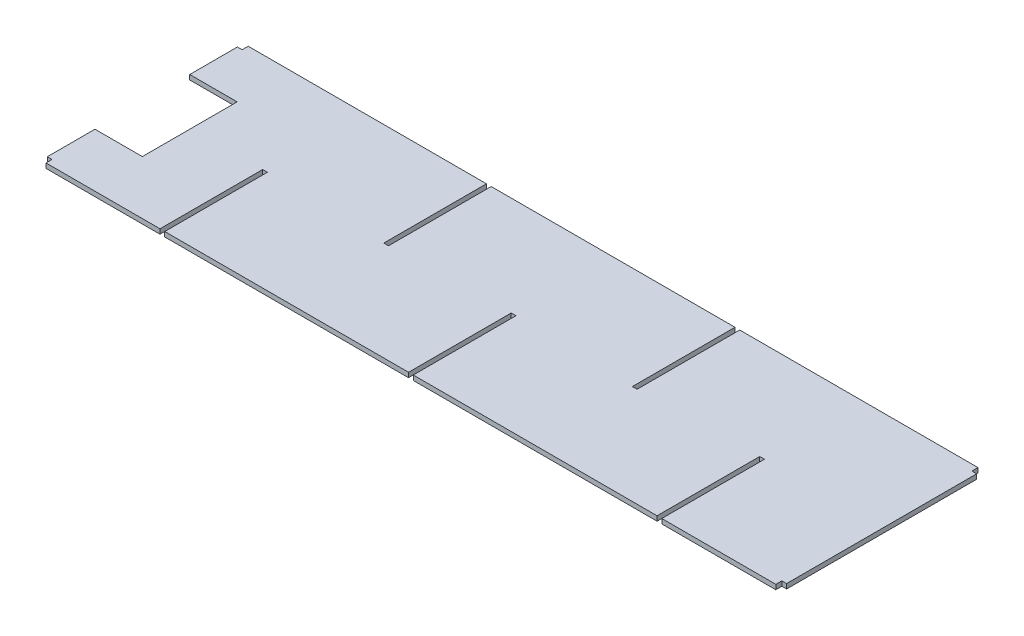
ISO-10303-21;
HEADER;
FILE_DESCRIPTION(('STEP AP214'),'2;1');
FILE_NAME('part.step','',(''),(''),'','','');
FILE_SCHEMA(('AUTOMOTIVE_DESIGN { 1 0 10303 214 1 1 1 1 }'));
ENDSEC;
DATA;
#1=APPLICATION_CONTEXT('core data for automotive mechanical design processes');
#2=APPLICATION_PROTOCOL_DEFINITION('international standard','automotive_design',2000,#1);
#3=PRODUCT_CONTEXT('',#1,'mechanical');
#4=PRODUCT('Part','Part','',(#3));
#5=PRODUCT_RELATED_PRODUCT_CATEGORY('part','',(#4));
#6=PRODUCT_DEFINITION_FORMATION('','',#4);
#7=PRODUCT_DEFINITION_CONTEXT('part definition',#1,'design');
#8=PRODUCT_DEFINITION('design','',#6,#7);
#9=PRODUCT_DEFINITION_SHAPE('','',#8);
#10=(LENGTH_UNIT() NAMED_UNIT(*) SI_UNIT(.MILLI.,.METRE.));
#11=(NAMED_UNIT(*) PLANE_ANGLE_UNIT() SI_UNIT($,.RADIAN.));
#12=(NAMED_UNIT(*) SI_UNIT($,.STERADIAN.) SOLID_ANGLE_UNIT());
#13=UNCERTAINTY_MEASURE_WITH_UNIT(LENGTH_MEASURE(1.E-05),#10,'distance_accuracy_value','');
#14=(GEOMETRIC_REPRESENTATION_CONTEXT(3) GLOBAL_UNCERTAINTY_ASSIGNED_CONTEXT((#13)) GLOBAL_UNIT_ASSIGNED_CONTEXT((#10,
#11,#12)) REPRESENTATION_CONTEXT('',''));
#15=CARTESIAN_POINT('',(0.,0.,0.));
#16=DIRECTION('',(0.,0.,1.));
#17=DIRECTION('',(1.,0.,0.));
#18=AXIS2_PLACEMENT_3D('',#15,#16,#17);
#19=CARTESIAN_POINT('',(0.,1.5,0.));
#20=DIRECTION('',(1.,0.,0.));
#21=DIRECTION('',(0.,0.,-1.));
#22=AXIS2_PLACEMENT_3D('',#19,#20,#21);
#23=PLANE('',#22);
#24=DIRECTION('',(0.,0.,1.));
#25=VECTOR('',#24,1.);
#26=CARTESIAN_POINT('',(0.,1.5,0.));
#27=LINE('',#26,#25);
#28=CARTESIAN_POINT('',(0.,1.5,-62.085));
#29=VERTEX_POINT('',#28);
#30=CARTESIAN_POINT('',(0.,1.5,-47.));
#31=VERTEX_POINT('',#30);
#32=EDGE_CURVE('E545',#29,#31,#27,.T.);
#33=ORIENTED_EDGE('',*,*,#32,.F.);
#34=DIRECTION('',(0.,1.,0.));
#35=VECTOR('',#34,1.);
#36=CARTESIAN_POINT('',(0.,0.,-62.085));
#37=LINE('',#36,#35);
#38=CARTESIAN_POINT('',(0.,0.,-62.085));
#39=VERTEX_POINT('',#38);
#40=EDGE_CURVE('E310',#39,#29,#37,.T.);
#41=ORIENTED_EDGE('',*,*,#40,.F.);
#42=DIRECTION('',(0.,0.,1.));
#43=VECTOR('',#42,1.);
#44=CARTESIAN_POINT('',(0.,0.,0.));
#45=LINE('',#44,#43);
#46=CARTESIAN_POINT('',(0.,0.,-47.));
#47=VERTEX_POINT('',#46);
#48=EDGE_CURVE('E303',#39,#47,#45,.T.);
#49=ORIENTED_EDGE('',*,*,#48,.T.);
#50=DIRECTION('',(0.,1.,0.));
#51=VECTOR('',#50,1.);
#52=CARTESIAN_POINT('',(0.,0.,-47.));
#53=LINE('',#52,#51);
#54=EDGE_CURVE('E284',#47,#31,#53,.T.);
#55=ORIENTED_EDGE('',*,*,#54,.T.);
#56=EDGE_LOOP('',(#33,#41,#49,#55));
#57=FACE_BOUND('',#56,.T.);
#58=ADVANCED_FACE('F45',(#57),#23,.F.);
#59=CARTESIAN_POINT('',(0.,1.5,0.));
#60=DIRECTION('',(0.,0.,-1.));
#61=DIRECTION('',(-1.,0.,0.));
#62=AXIS2_PLACEMENT_3D('',#59,#60,#61);
#63=PLANE('',#62);
#64=DIRECTION('',(1.,0.,0.));
#65=VECTOR('',#64,1.);
#66=CARTESIAN_POINT('',(0.,0.,0.));
#67=LINE('',#66,#65);
#68=CARTESIAN_POINT('',(117.75,0.,0.));
#69=VERTEX_POINT('',#68);
#70=CARTESIAN_POINT('',(194.916666666667,0.,0.));
#71=VERTEX_POINT('',#70);
#72=EDGE_CURVE('E318',#69,#71,#67,.T.);
#73=ORIENTED_EDGE('',*,*,#72,.T.);
#74=DIRECTION('',(0.,1.,0.));
#75=VECTOR('',#74,1.);
#76=CARTESIAN_POINT('',(194.916666666667,0.,0.));
#77=LINE('',#76,#75);
#78=CARTESIAN_POINT('',(194.916666666667,1.5,0.));
#79=VERTEX_POINT('',#78);
#80=EDGE_CURVE('E356',#71,#79,#77,.T.);
#81=ORIENTED_EDGE('',*,*,#80,.T.);
#82=DIRECTION('',(1.,0.,0.));
#83=VECTOR('',#82,1.);
#84=CARTESIAN_POINT('',(0.,1.5,0.));
#85=LINE('',#84,#83);
#86=CARTESIAN_POINT('',(117.75,1.5,0.));
#87=VERTEX_POINT('',#86);
#88=EDGE_CURVE('E549',#87,#79,#85,.T.);
#89=ORIENTED_EDGE('',*,*,#88,.F.);
#90=DIRECTION('',(0.,1.,0.));
#91=VECTOR('',#90,1.);
#92=CARTESIAN_POINT('',(117.75,0.,0.));
#93=LINE('',#92,#91);
#94=EDGE_CURVE('E358',#69,#87,#93,.T.);
#95=ORIENTED_EDGE('',*,*,#94,.F.);
#96=EDGE_LOOP('',(#73,#81,#89,#95));
#97=FACE_BOUND('',#96,.T.);
#98=ADVANCED_FACE('F354',(#97),#63,.F.);
#99=CARTESIAN_POINT('',(39.0833333333333,0.,0.));
#100=VERTEX_POINT('',#99);
#101=CARTESIAN_POINT('',(116.25,0.,0.));
#102=VERTEX_POINT('',#101);
#103=EDGE_CURVE('E337',#100,#102,#67,.T.);
#104=ORIENTED_EDGE('',*,*,#103,.T.);
#105=DIRECTION('',(0.,1.,0.));
#106=VECTOR('',#105,1.);
#107=CARTESIAN_POINT('',(116.25,0.,0.));
#108=LINE('',#107,#106);
#109=CARTESIAN_POINT('',(116.25,1.5,0.));
#110=VERTEX_POINT('',#109);
#111=EDGE_CURVE('E384',#102,#110,#108,.T.);
#112=ORIENTED_EDGE('',*,*,#111,.T.);
#113=CARTESIAN_POINT('',(39.0833333333333,1.5,0.));
#114=VERTEX_POINT('',#113);
#115=EDGE_CURVE('E560',#114,#110,#85,.T.);
#116=ORIENTED_EDGE('',*,*,#115,.F.);
#117=DIRECTION('',(0.,1.,0.));
#118=VECTOR('',#117,1.);
#119=CARTESIAN_POINT('',(39.0833333333333,0.,0.));
#120=LINE('',#119,#118);
#121=EDGE_CURVE('E436',#100,#114,#120,.T.);
#122=ORIENTED_EDGE('',*,*,#121,.F.);
#123=EDGE_LOOP('',(#104,#112,#116,#122));
#124=FACE_BOUND('',#123,.T.);
#125=ADVANCED_FACE('F766',(#124),#63,.F.);
#126=CARTESIAN_POINT('',(1.50000000000001,1.5,0.));
#127=VERTEX_POINT('',#126);
#128=CARTESIAN_POINT('',(37.5833333333333,1.5,0.));
#129=VERTEX_POINT('',#128);
#130=EDGE_CURVE('E550',#127,#129,#85,.T.);
#131=ORIENTED_EDGE('',*,*,#130,.F.);
#132=DIRECTION('',(0.,1.,0.));
#133=VECTOR('',#132,1.);
#134=CARTESIAN_POINT('',(1.50000000000001,0.,0.));
#135=LINE('',#134,#133);
#136=CARTESIAN_POINT('',(1.50000000000001,0.,0.));
#137=VERTEX_POINT('',#136);
#138=EDGE_CURVE('E608',#137,#127,#135,.T.);
#139=ORIENTED_EDGE('',*,*,#138,.F.);
#140=CARTESIAN_POINT('',(37.5833333333333,0.,0.));
#141=VERTEX_POINT('',#140);
#142=EDGE_CURVE('E320',#137,#141,#67,.T.);
#143=ORIENTED_EDGE('',*,*,#142,.T.);
#144=DIRECTION('',(0.,1.,0.));
#145=VECTOR('',#144,1.);
#146=CARTESIAN_POINT('',(37.5833333333333,0.,0.));
#147=LINE('',#146,#145);
#148=EDGE_CURVE('E426',#141,#129,#147,.T.);
#149=ORIENTED_EDGE('',*,*,#148,.T.);
#150=EDGE_LOOP('',(#131,#139,#143,#149));
#151=FACE_BOUND('',#150,.T.);
#152=ADVANCED_FACE('F773',(#151),#63,.F.);
#153=CARTESIAN_POINT('',(0.,1.5,-64.));
#154=DIRECTION('',(0.,0.,1.));
#155=DIRECTION('',(1.,0.,0.));
#156=AXIS2_PLACEMENT_3D('',#153,#154,#155);
#157=PLANE('',#156);
#158=DIRECTION('',(-1.,0.,0.));
#159=VECTOR('',#158,1.);
#160=CARTESIAN_POINT('',(0.,1.5,-64.));
#161=LINE('',#160,#159);
#162=CARTESIAN_POINT('',(232.5,1.5,-64.));
#163=VERTEX_POINT('',#162);
#164=CARTESIAN_POINT('',(157.083333333333,1.5,-64.));
#165=VERTEX_POINT('',#164);
#166=EDGE_CURVE('E11',#163,#165,#161,.T.);
#167=ORIENTED_EDGE('',*,*,#166,.F.);
#168=DIRECTION('',(0.,1.,0.));
#169=VECTOR('',#168,1.);
#170=CARTESIAN_POINT('',(232.5,0.,-64.));
#171=LINE('',#170,#169);
#172=CARTESIAN_POINT('',(232.5,0.,-64.));
#173=VERTEX_POINT('',#172);
#174=EDGE_CURVE('E642',#173,#163,#171,.T.);
#175=ORIENTED_EDGE('',*,*,#174,.F.);
#176=DIRECTION('',(-1.,0.,0.));
#177=VECTOR('',#176,1.);
#178=CARTESIAN_POINT('',(0.,0.,-64.));
#179=LINE('',#178,#177);
#180=CARTESIAN_POINT('',(157.083333333333,0.,-64.));
#181=VERTEX_POINT('',#180);
#182=EDGE_CURVE('E335',#173,#181,#179,.T.);
#183=ORIENTED_EDGE('',*,*,#182,.T.);
#184=DIRECTION('',(0.,1.,0.));
#185=VECTOR('',#184,1.);
#186=CARTESIAN_POINT('',(157.083333333333,0.,-64.));
#187=LINE('',#186,#185);
#188=EDGE_CURVE('E397',#181,#165,#187,.T.);
#189=ORIENTED_EDGE('',*,*,#188,.T.);
#190=EDGE_LOOP('',(#167,#175,#183,#189));
#191=FACE_BOUND('',#190,.T.);
#192=ADVANCED_FACE('F732',(#191),#157,.F.);
#193=CARTESIAN_POINT('',(76.9166666666666,0.,-64.));
#194=VERTEX_POINT('',#193);
#195=CARTESIAN_POINT('',(1.5,0.,-64.));
#196=VERTEX_POINT('',#195);
#197=EDGE_CURVE('E49',#194,#196,#179,.T.);
#198=ORIENTED_EDGE('',*,*,#197,.T.);
#199=DIRECTION('',(0.,1.,0.));
#200=VECTOR('',#199,1.);
#201=CARTESIAN_POINT('',(1.5,0.,-64.));
#202=LINE('',#201,#200);
#203=CARTESIAN_POINT('',(1.5,1.5,-64.));
#204=VERTEX_POINT('',#203);
#205=EDGE_CURVE('E632',#196,#204,#202,.T.);
#206=ORIENTED_EDGE('',*,*,#205,.T.);
#207=CARTESIAN_POINT('',(76.9166666666666,1.5,-64.));
#208=VERTEX_POINT('',#207);
#209=EDGE_CURVE('E57',#208,#204,#161,.T.);
#210=ORIENTED_EDGE('',*,*,#209,.F.);
#211=DIRECTION('',(0.,1.,0.));
#212=VECTOR('',#211,1.);
#213=CARTESIAN_POINT('',(76.9166666666666,0.,-64.));
#214=LINE('',#213,#212);
#215=EDGE_CURVE('E594',#194,#208,#214,.T.);
#216=ORIENTED_EDGE('',*,*,#215,.F.);
#217=EDGE_LOOP('',(#198,#206,#210,#216));
#218=FACE_BOUND('',#217,.T.);
#219=ADVANCED_FACE('F711',(#218),#157,.F.);
#220=CARTESIAN_POINT('',(0.,0.,-17.));
#221=VERTEX_POINT('',#220);
#222=CARTESIAN_POINT('',(0.,0.,-1.915));
#223=VERTEX_POINT('',#222);
#224=EDGE_CURVE('E313',#221,#223,#45,.T.);
#225=ORIENTED_EDGE('',*,*,#224,.T.);
#226=DIRECTION('',(0.,1.,0.));
#227=VECTOR('',#226,1.);
#228=CARTESIAN_POINT('',(0.,0.,-1.915));
#229=LINE('',#228,#227);
#230=CARTESIAN_POINT('',(0.,1.5,-1.915));
#231=VERTEX_POINT('',#230);
#232=EDGE_CURVE('E615',#223,#231,#229,.T.);
#233=ORIENTED_EDGE('',*,*,#232,.T.);
#234=CARTESIAN_POINT('',(0.,1.5,-17.));
#235=VERTEX_POINT('',#234);
#236=EDGE_CURVE('E541',#235,#231,#27,.T.);
#237=ORIENTED_EDGE('',*,*,#236,.F.);
#238=DIRECTION('',(0.,1.,0.));
#239=VECTOR('',#238,1.);
#240=CARTESIAN_POINT('',(0.,0.,-17.));
#241=LINE('',#240,#239);
#242=EDGE_CURVE('E307',#221,#235,#241,.T.);
#243=ORIENTED_EDGE('',*,*,#242,.F.);
#244=EDGE_LOOP('',(#225,#233,#237,#243));
#245=FACE_BOUND('',#244,.T.);
#246=ADVANCED_FACE('F47',(#245),#23,.F.);
#247=CARTESIAN_POINT('',(196.416666666667,0.,0.));
#248=VERTEX_POINT('',#247);
#249=CARTESIAN_POINT('',(232.5,0.,0.));
#250=VERTEX_POINT('',#249);
#251=EDGE_CURVE('E312',#248,#250,#67,.T.);
#252=ORIENTED_EDGE('',*,*,#251,.T.);
#253=DIRECTION('',(0.,1.,0.));
#254=VECTOR('',#253,1.);
#255=CARTESIAN_POINT('',(232.5,0.,0.));
#256=LINE('',#255,#254);
#257=CARTESIAN_POINT('',(232.5,1.5,0.));
#258=VERTEX_POINT('',#257);
#259=EDGE_CURVE('E663',#250,#258,#256,.T.);
#260=ORIENTED_EDGE('',*,*,#259,.T.);
#261=CARTESIAN_POINT('',(196.416666666667,1.5,0.));
#262=VERTEX_POINT('',#261);
#263=EDGE_CURVE('E546',#262,#258,#85,.T.);
#264=ORIENTED_EDGE('',*,*,#263,.F.);
#265=DIRECTION('',(0.,1.,0.));
#266=VECTOR('',#265,1.);
#267=CARTESIAN_POINT('',(196.416666666667,0.,0.));
#268=LINE('',#267,#266);
#269=EDGE_CURVE('E371',#248,#262,#268,.T.);
#270=ORIENTED_EDGE('',*,*,#269,.F.);
#271=EDGE_LOOP('',(#252,#260,#264,#270));
#272=FACE_BOUND('',#271,.T.);
#273=ADVANCED_FACE('F747',(#272),#63,.F.);
#274=CARTESIAN_POINT('',(234.,1.5,0.));
#275=DIRECTION('',(-1.,0.,0.));
#276=DIRECTION('',(0.,0.,1.));
#277=AXIS2_PLACEMENT_3D('',#274,#275,#276);
#278=PLANE('',#277);
#279=DIRECTION('',(0.,0.,-1.));
#280=VECTOR('',#279,1.);
#281=CARTESIAN_POINT('',(234.,1.5,0.));
#282=LINE('',#281,#280);
#283=CARTESIAN_POINT('',(234.,1.5,-1.915));
#284=VERTEX_POINT('',#283);
#285=CARTESIAN_POINT('',(234.,1.5,-62.085));
#286=VERTEX_POINT('',#285);
#287=EDGE_CURVE('E551',#284,#286,#282,.T.);
#288=ORIENTED_EDGE('',*,*,#287,.F.);
#289=DIRECTION('',(0.,1.,0.));
#290=VECTOR('',#289,1.);
#291=CARTESIAN_POINT('',(234.,0.,-1.915));
#292=LINE('',#291,#290);
#293=CARTESIAN_POINT('',(234.,0.,-1.915));
#294=VERTEX_POINT('',#293);
#295=EDGE_CURVE('E657',#294,#284,#292,.T.);
#296=ORIENTED_EDGE('',*,*,#295,.F.);
#297=DIRECTION('',(0.,0.,-1.));
#298=VECTOR('',#297,1.);
#299=CARTESIAN_POINT('',(234.,0.,0.));
#300=LINE('',#299,#298);
#301=CARTESIAN_POINT('',(234.,0.,-62.085));
#302=VERTEX_POINT('',#301);
#303=EDGE_CURVE('E324',#294,#302,#300,.T.);
#304=ORIENTED_EDGE('',*,*,#303,.T.);
#305=DIRECTION('',(0.,1.,0.));
#306=VECTOR('',#305,1.);
#307=CARTESIAN_POINT('',(234.,0.,-62.085));
#308=LINE('',#307,#306);
#309=EDGE_CURVE('E648',#302,#286,#308,.T.);
#310=ORIENTED_EDGE('',*,*,#309,.T.);
#311=EDGE_LOOP('',(#288,#296,#304,#310));
#312=FACE_BOUND('',#311,.T.);
#313=ADVANCED_FACE('F739',(#312),#278,.F.);
#314=CARTESIAN_POINT('',(155.583333333333,1.5,-64.));
#315=VERTEX_POINT('',#314);
#316=CARTESIAN_POINT('',(78.4166666666667,1.5,-64.));
#317=VERTEX_POINT('',#316);
#318=EDGE_CURVE('E55',#315,#317,#161,.T.);
#319=ORIENTED_EDGE('',*,*,#318,.F.);
#320=DIRECTION('',(0.,1.,0.));
#321=VECTOR('',#320,1.);
#322=CARTESIAN_POINT('',(155.583333333333,0.,-64.));
#323=LINE('',#322,#321);
#324=CARTESIAN_POINT('',(155.583333333333,0.,-64.));
#325=VERTEX_POINT('',#324);
#326=EDGE_CURVE('E385',#325,#315,#323,.T.);
#327=ORIENTED_EDGE('',*,*,#326,.F.);
#328=CARTESIAN_POINT('',(78.4166666666667,0.,-64.));
#329=VERTEX_POINT('',#328);
#330=EDGE_CURVE('E334',#325,#329,#179,.T.);
#331=ORIENTED_EDGE('',*,*,#330,.T.);
#332=DIRECTION('',(0.,1.,0.));
#333=VECTOR('',#332,1.);
#334=CARTESIAN_POINT('',(78.4166666666667,0.,-64.));
#335=LINE('',#334,#333);
#336=EDGE_CURVE('E690',#329,#317,#335,.T.);
#337=ORIENTED_EDGE('',*,*,#336,.T.);
#338=EDGE_LOOP('',(#319,#327,#331,#337));
#339=FACE_BOUND('',#338,.T.);
#340=ADVANCED_FACE('F722',(#339),#157,.F.);
#341=CARTESIAN_POINT('',(0.,1.5,0.));
#342=DIRECTION('',(0.,-1.,0.));
#343=DIRECTION('',(0.,0.,-1.));
#344=AXIS2_PLACEMENT_3D('',#341,#342,#343);
#345=PLANE('',#344);
#346=ORIENTED_EDGE('',*,*,#263,.T.);
#347=DIRECTION('',(0.,0.,-1.));
#348=VECTOR('',#347,1.);
#349=CARTESIAN_POINT('',(232.5,1.5,-3.36980226142753E-12));
#350=LINE('',#349,#348);
#351=CARTESIAN_POINT('',(232.5,1.5,-1.915));
#352=VERTEX_POINT('',#351);
#353=EDGE_CURVE('E322',#258,#352,#350,.T.);
#354=ORIENTED_EDGE('',*,*,#353,.T.);
#355=DIRECTION('',(1.,0.,0.));
#356=VECTOR('',#355,1.);
#357=CARTESIAN_POINT('',(0.,1.5,-1.915));
#358=LINE('',#357,#356);
#359=EDGE_CURVE('E534',#352,#284,#358,.T.);
#360=ORIENTED_EDGE('',*,*,#359,.T.);
#361=ORIENTED_EDGE('',*,*,#287,.T.);
#362=DIRECTION('',(-1.,0.,0.));
#363=VECTOR('',#362,1.);
#364=CARTESIAN_POINT('',(0.,1.5,-62.085));
#365=LINE('',#364,#363);
#366=CARTESIAN_POINT('',(232.5,1.5,-62.085));
#367=VERTEX_POINT('',#366);
#368=EDGE_CURVE('E530',#286,#367,#365,.T.);
#369=ORIENTED_EDGE('',*,*,#368,.T.);
#370=DIRECTION('',(0.,0.,-1.));
#371=VECTOR('',#370,1.);
#372=CARTESIAN_POINT('',(232.499999999999,1.5,3.36980226142752E-12));
#373=LINE('',#372,#371);
#374=EDGE_CURVE('E526',#367,#163,#373,.T.);
#375=ORIENTED_EDGE('',*,*,#374,.T.);
#376=ORIENTED_EDGE('',*,*,#166,.T.);
#377=DIRECTION('',(0.,0.,1.));
#378=VECTOR('',#377,1.);
#379=CARTESIAN_POINT('',(157.083333333333,1.5,0.));
#380=LINE('',#379,#378);
#381=CARTESIAN_POINT('',(157.083333333333,1.5,-31.5));
#382=VERTEX_POINT('',#381);
#383=EDGE_CURVE('E506',#165,#382,#380,.T.);
#384=ORIENTED_EDGE('',*,*,#383,.T.);
#385=DIRECTION('',(-1.,0.,0.));
#386=VECTOR('',#385,1.);
#387=CARTESIAN_POINT('',(0.,1.5,-31.5));
#388=LINE('',#387,#386);
#389=CARTESIAN_POINT('',(155.583333333333,1.5,-31.5));
#390=VERTEX_POINT('',#389);
#391=EDGE_CURVE('E502',#382,#390,#388,.T.);
#392=ORIENTED_EDGE('',*,*,#391,.T.);
#393=DIRECTION('',(0.,0.,-1.));
#394=VECTOR('',#393,1.);
#395=CARTESIAN_POINT('',(155.583333333333,1.5,0.));
#396=LINE('',#395,#394);
#397=EDGE_CURVE('E498',#390,#315,#396,.T.);
#398=ORIENTED_EDGE('',*,*,#397,.T.);
#399=ORIENTED_EDGE('',*,*,#318,.T.);
#400=DIRECTION('',(0.,0.,1.));
#401=VECTOR('',#400,1.);
#402=CARTESIAN_POINT('',(78.4166666666667,1.5,0.));
#403=LINE('',#402,#401);
#404=CARTESIAN_POINT('',(78.4166666666667,1.5,-31.5));
#405=VERTEX_POINT('',#404);
#406=EDGE_CURVE('E466',#317,#405,#403,.T.);
#407=ORIENTED_EDGE('',*,*,#406,.T.);
#408=DIRECTION('',(-1.,0.,0.));
#409=VECTOR('',#408,1.);
#410=CARTESIAN_POINT('',(0.,1.5,-31.5));
#411=LINE('',#410,#409);
#412=CARTESIAN_POINT('',(76.9166666666667,1.5,-31.5));
#413=VERTEX_POINT('',#412);
#414=EDGE_CURVE('E462',#405,#413,#411,.T.);
#415=ORIENTED_EDGE('',*,*,#414,.T.);
#416=DIRECTION('',(0.,0.,-1.));
#417=VECTOR('',#416,1.);
#418=CARTESIAN_POINT('',(76.9166666666667,1.5,0.));
#419=LINE('',#418,#417);
#420=EDGE_CURVE('E470',#413,#208,#419,.T.);
#421=ORIENTED_EDGE('',*,*,#420,.T.);
#422=ORIENTED_EDGE('',*,*,#209,.T.);
#423=DIRECTION('',(0.,0.,1.));
#424=VECTOR('',#423,1.);
#425=CARTESIAN_POINT('',(1.5,1.5,0.));
#426=LINE('',#425,#424);
#427=CARTESIAN_POINT('',(1.5,1.5,-62.085));
#428=VERTEX_POINT('',#427);
#429=EDGE_CURVE('E522',#204,#428,#426,.T.);
#430=ORIENTED_EDGE('',*,*,#429,.T.);
#431=DIRECTION('',(-1.,0.,0.));
#432=VECTOR('',#431,1.);
#433=CARTESIAN_POINT('',(0.,1.5,-62.085));
#434=LINE('',#433,#432);
#435=EDGE_CURVE('E518',#428,#29,#434,.T.);
#436=ORIENTED_EDGE('',*,*,#435,.T.);
#437=ORIENTED_EDGE('',*,*,#32,.T.);
#438=DIRECTION('',(1.,0.,0.));
#439=VECTOR('',#438,1.);
#440=CARTESIAN_POINT('',(0.,1.5,-47.));
#441=LINE('',#440,#439);
#442=CARTESIAN_POINT('',(15.,1.5,-47.));
#443=VERTEX_POINT('',#442);
#444=EDGE_CURVE('E291',#31,#443,#441,.T.);
#445=ORIENTED_EDGE('',*,*,#444,.T.);
#446=DIRECTION('',(0.,0.,1.));
#447=VECTOR('',#446,1.);
#448=CARTESIAN_POINT('',(15.,1.5,0.));
#449=LINE('',#448,#447);
#450=CARTESIAN_POINT('',(15.,1.5,-17.));
#451=VERTEX_POINT('',#450);
#452=EDGE_CURVE('E456',#443,#451,#449,.T.);
#453=ORIENTED_EDGE('',*,*,#452,.T.);
#454=DIRECTION('',(-1.,0.,0.));
#455=VECTOR('',#454,1.);
#456=CARTESIAN_POINT('',(0.,1.5,-17.));
#457=LINE('',#456,#455);
#458=EDGE_CURVE('E452',#451,#235,#457,.T.);
#459=ORIENTED_EDGE('',*,*,#458,.T.);
#460=ORIENTED_EDGE('',*,*,#236,.T.);
#461=DIRECTION('',(1.,0.,0.));
#462=VECTOR('',#461,1.);
#463=CARTESIAN_POINT('',(0.,1.5,-1.915));
#464=LINE('',#463,#462);
#465=CARTESIAN_POINT('',(1.50000000000001,1.5,-1.915));
#466=VERTEX_POINT('',#465);
#467=EDGE_CURVE('E514',#231,#466,#464,.T.);
#468=ORIENTED_EDGE('',*,*,#467,.T.);
#469=DIRECTION('',(0.,0.,1.));
#470=VECTOR('',#469,1.);
#471=CARTESIAN_POINT('',(1.50000000000001,1.5,0.));
#472=LINE('',#471,#470);
#473=EDGE_CURVE('E510',#466,#127,#472,.T.);
#474=ORIENTED_EDGE('',*,*,#473,.T.);
#475=ORIENTED_EDGE('',*,*,#130,.T.);
#476=DIRECTION('',(0.,0.,-1.));
#477=VECTOR('',#476,1.);
#478=CARTESIAN_POINT('',(37.5833333333333,1.5,0.));
#479=LINE('',#478,#477);
#480=CARTESIAN_POINT('',(37.5833333333333,1.5,-32.5));
#481=VERTEX_POINT('',#480);
#482=EDGE_CURVE('E448',#129,#481,#479,.T.);
#483=ORIENTED_EDGE('',*,*,#482,.T.);
#484=DIRECTION('',(1.,0.,0.));
#485=VECTOR('',#484,1.);
#486=CARTESIAN_POINT('',(0.,1.5,-32.5));
#487=LINE('',#486,#485);
#488=CARTESIAN_POINT('',(39.0833333333333,1.5,-32.5));
#489=VERTEX_POINT('',#488);
#490=EDGE_CURVE('E444',#481,#489,#487,.T.);
#491=ORIENTED_EDGE('',*,*,#490,.T.);
#492=DIRECTION('',(0.,0.,1.));
#493=VECTOR('',#492,1.);
#494=CARTESIAN_POINT('',(39.0833333333333,1.5,0.));
#495=LINE('',#494,#493);
#496=EDGE_CURVE('E431',#489,#114,#495,.T.);
#497=ORIENTED_EDGE('',*,*,#496,.T.);
#498=ORIENTED_EDGE('',*,*,#115,.T.);
#499=DIRECTION('',(0.,0.,-1.));
#500=VECTOR('',#499,1.);
#501=CARTESIAN_POINT('',(116.25,1.5,0.));
#502=LINE('',#501,#500);
#503=CARTESIAN_POINT('',(116.25,1.5,-32.5));
#504=VERTEX_POINT('',#503);
#505=EDGE_CURVE('E482',#110,#504,#502,.T.);
#506=ORIENTED_EDGE('',*,*,#505,.T.);
#507=DIRECTION('',(1.,0.,0.));
#508=VECTOR('',#507,1.);
#509=CARTESIAN_POINT('',(0.,1.5,-32.5));
#510=LINE('',#509,#508);
#511=CARTESIAN_POINT('',(117.75,1.5,-32.5));
#512=VERTEX_POINT('',#511);
#513=EDGE_CURVE('E478',#504,#512,#510,.T.);
#514=ORIENTED_EDGE('',*,*,#513,.T.);
#515=DIRECTION('',(0.,0.,1.));
#516=VECTOR('',#515,1.);
#517=CARTESIAN_POINT('',(117.75,1.5,0.));
#518=LINE('',#517,#516);
#519=EDGE_CURVE('E474',#512,#87,#518,.T.);
#520=ORIENTED_EDGE('',*,*,#519,.T.);
#521=ORIENTED_EDGE('',*,*,#88,.T.);
#522=DIRECTION('',(0.,0.,-1.));
#523=VECTOR('',#522,1.);
#524=CARTESIAN_POINT('',(194.916666666667,1.5,0.));
#525=LINE('',#524,#523);
#526=CARTESIAN_POINT('',(194.916666666667,1.5,-32.5));
#527=VERTEX_POINT('',#526);
#528=EDGE_CURVE('E494',#79,#527,#525,.T.);
#529=ORIENTED_EDGE('',*,*,#528,.T.);
#530=DIRECTION('',(1.,0.,0.));
#531=VECTOR('',#530,1.);
#532=CARTESIAN_POINT('',(0.,1.5,-32.5));
#533=LINE('',#532,#531);
#534=CARTESIAN_POINT('',(196.416666666667,1.5,-32.5));
#535=VERTEX_POINT('',#534);
#536=EDGE_CURVE('E490',#527,#535,#533,.T.);
#537=ORIENTED_EDGE('',*,*,#536,.T.);
#538=DIRECTION('',(0.,0.,1.));
#539=VECTOR('',#538,1.);
#540=CARTESIAN_POINT('',(196.416666666667,1.5,0.));
#541=LINE('',#540,#539);
#542=EDGE_CURVE('E486',#535,#262,#541,.T.);
#543=ORIENTED_EDGE('',*,*,#542,.T.);
#544=EDGE_LOOP('',(#346,#354,#360,#361,#369,#375,#376,#384,#392,#398,#399,#407,#415,#421,#422,
#430,#436,#437,#445,#453,#459,#460,#468,#474,#475,#483,#491,#497,#498,#506,#514,#520,#521,#529,
#537,#543));
#545=FACE_BOUND('',#544,.T.);
#546=ADVANCED_FACE('F566',(#545),#345,.F.);
#547=CARTESIAN_POINT('',(0.,0.,0.));
#548=DIRECTION('',(0.,-1.,0.));
#549=DIRECTION('',(0.,0.,-1.));
#550=AXIS2_PLACEMENT_3D('',#547,#548,#549);
#551=PLANE('',#550);
#552=DIRECTION('',(0.,0.,1.));
#553=VECTOR('',#552,1.);
#554=CARTESIAN_POINT('',(232.5,0.,0.));
#555=LINE('',#554,#553);
#556=CARTESIAN_POINT('',(232.5,0.,-1.915));
#557=VERTEX_POINT('',#556);
#558=EDGE_CURVE('E64',#557,#250,#555,.T.);
#559=ORIENTED_EDGE('',*,*,#558,.T.);
#560=ORIENTED_EDGE('',*,*,#251,.F.);
#561=DIRECTION('',(0.,0.,-1.));
#562=VECTOR('',#561,1.);
#563=CARTESIAN_POINT('',(196.416666666667,0.,0.));
#564=LINE('',#563,#562);
#565=CARTESIAN_POINT('',(196.416666666667,0.,-32.5));
#566=VERTEX_POINT('',#565);
#567=EDGE_CURVE('E375',#248,#566,#564,.T.);
#568=ORIENTED_EDGE('',*,*,#567,.T.);
#569=DIRECTION('',(-1.,0.,0.));
#570=VECTOR('',#569,1.);
#571=CARTESIAN_POINT('',(194.916666666667,0.,-32.5));
#572=LINE('',#571,#570);
#573=CARTESIAN_POINT('',(194.916666666667,0.,-32.5));
#574=VERTEX_POINT('',#573);
#575=EDGE_CURVE('E367',#566,#574,#572,.T.);
#576=ORIENTED_EDGE('',*,*,#575,.T.);
#577=DIRECTION('',(0.,0.,1.));
#578=VECTOR('',#577,1.);
#579=CARTESIAN_POINT('',(194.916666666667,0.,0.));
#580=LINE('',#579,#578);
#581=EDGE_CURVE('E365',#574,#71,#580,.T.);
#582=ORIENTED_EDGE('',*,*,#581,.T.);
#583=ORIENTED_EDGE('',*,*,#72,.F.);
#584=DIRECTION('',(0.,0.,-1.));
#585=VECTOR('',#584,1.);
#586=CARTESIAN_POINT('',(117.75,0.,0.));
#587=LINE('',#586,#585);
#588=CARTESIAN_POINT('',(117.75,0.,-32.5));
#589=VERTEX_POINT('',#588);
#590=EDGE_CURVE('E362',#69,#589,#587,.T.);
#591=ORIENTED_EDGE('',*,*,#590,.T.);
#592=DIRECTION('',(-1.,0.,0.));
#593=VECTOR('',#592,1.);
#594=CARTESIAN_POINT('',(116.25,0.,-32.5));
#595=LINE('',#594,#593);
#596=CARTESIAN_POINT('',(116.25,0.,-32.5));
#597=VERTEX_POINT('',#596);
#598=EDGE_CURVE('E575',#589,#597,#595,.T.);
#599=ORIENTED_EDGE('',*,*,#598,.T.);
#600=DIRECTION('',(0.,0.,1.));
#601=VECTOR('',#600,1.);
#602=CARTESIAN_POINT('',(116.25,0.,0.));
#603=LINE('',#602,#601);
#604=EDGE_CURVE('E581',#597,#102,#603,.T.);
#605=ORIENTED_EDGE('',*,*,#604,.T.);
#606=ORIENTED_EDGE('',*,*,#103,.F.);
#607=DIRECTION('',(0.,0.,-1.));
#608=VECTOR('',#607,1.);
#609=CARTESIAN_POINT('',(39.0833333333333,0.,0.));
#610=LINE('',#609,#608);
#611=CARTESIAN_POINT('',(39.0833333333333,0.,-32.5));
#612=VERTEX_POINT('',#611);
#613=EDGE_CURVE('E417',#100,#612,#610,.T.);
#614=ORIENTED_EDGE('',*,*,#613,.T.);
#615=DIRECTION('',(-1.,0.,0.));
#616=VECTOR('',#615,1.);
#617=CARTESIAN_POINT('',(37.5833333333333,0.,-32.5));
#618=LINE('',#617,#616);
#619=CARTESIAN_POINT('',(37.5833333333333,0.,-32.5));
#620=VERTEX_POINT('',#619);
#621=EDGE_CURVE('E422',#612,#620,#618,.T.);
#622=ORIENTED_EDGE('',*,*,#621,.T.);
#623=DIRECTION('',(0.,0.,1.));
#624=VECTOR('',#623,1.);
#625=CARTESIAN_POINT('',(37.5833333333333,0.,0.));
#626=LINE('',#625,#624);
#627=EDGE_CURVE('E413',#620,#141,#626,.T.);
#628=ORIENTED_EDGE('',*,*,#627,.T.);
#629=ORIENTED_EDGE('',*,*,#142,.F.);
#630=DIRECTION('',(0.,0.,-1.));
#631=VECTOR('',#630,1.);
#632=CARTESIAN_POINT('',(1.50000000000001,0.,0.));
#633=LINE('',#632,#631);
#634=CARTESIAN_POINT('',(1.50000000000001,0.,-1.915));
#635=VERTEX_POINT('',#634);
#636=EDGE_CURVE('E401',#137,#635,#633,.T.);
#637=ORIENTED_EDGE('',*,*,#636,.T.);
#638=DIRECTION('',(-1.,0.,0.));
#639=VECTOR('',#638,1.);
#640=CARTESIAN_POINT('',(0.,0.,-1.915));
#641=LINE('',#640,#639);
#642=EDGE_CURVE('E604',#635,#223,#641,.T.);
#643=ORIENTED_EDGE('',*,*,#642,.T.);
#644=ORIENTED_EDGE('',*,*,#224,.F.);
#645=DIRECTION('',(1.,0.,0.));
#646=VECTOR('',#645,1.);
#647=CARTESIAN_POINT('',(0.,0.,-17.));
#648=LINE('',#647,#646);
#649=CARTESIAN_POINT('',(15.,0.,-17.));
#650=VERTEX_POINT('',#649);
#651=EDGE_CURVE('E667',#221,#650,#648,.T.);
#652=ORIENTED_EDGE('',*,*,#651,.T.);
#653=DIRECTION('',(0.,0.,-1.));
#654=VECTOR('',#653,1.);
#655=CARTESIAN_POINT('',(15.,0.,-47.));
#656=LINE('',#655,#654);
#657=CARTESIAN_POINT('',(15.,0.,-47.));
#658=VERTEX_POINT('',#657);
#659=EDGE_CURVE('E305',#650,#658,#656,.T.);
#660=ORIENTED_EDGE('',*,*,#659,.T.);
#661=DIRECTION('',(-1.,0.,0.));
#662=VECTOR('',#661,1.);
#663=CARTESIAN_POINT('',(0.,0.,-47.));
#664=LINE('',#663,#662);
#665=EDGE_CURVE('E288',#658,#47,#664,.T.);
#666=ORIENTED_EDGE('',*,*,#665,.T.);
#667=ORIENTED_EDGE('',*,*,#48,.F.);
#668=DIRECTION('',(1.,0.,0.));
#669=VECTOR('',#668,1.);
#670=CARTESIAN_POINT('',(0.,0.,-62.085));
#671=LINE('',#670,#669);
#672=CARTESIAN_POINT('',(1.5,0.,-62.085));
#673=VERTEX_POINT('',#672);
#674=EDGE_CURVE('E619',#39,#673,#671,.T.);
#675=ORIENTED_EDGE('',*,*,#674,.T.);
#676=DIRECTION('',(0.,0.,-1.));
#677=VECTOR('',#676,1.);
#678=CARTESIAN_POINT('',(1.5,0.,-64.));
#679=LINE('',#678,#677);
#680=EDGE_CURVE('E622',#673,#196,#679,.T.);
#681=ORIENTED_EDGE('',*,*,#680,.T.);
#682=ORIENTED_EDGE('',*,*,#197,.F.);
#683=DIRECTION('',(0.,0.,1.));
#684=VECTOR('',#683,1.);
#685=CARTESIAN_POINT('',(76.9166666666666,0.,-64.));
#686=LINE('',#685,#684);
#687=CARTESIAN_POINT('',(76.9166666666667,0.,-31.5));
#688=VERTEX_POINT('',#687);
#689=EDGE_CURVE('E418',#194,#688,#686,.T.);
#690=ORIENTED_EDGE('',*,*,#689,.T.);
#691=DIRECTION('',(1.,0.,0.));
#692=VECTOR('',#691,1.);
#693=CARTESIAN_POINT('',(76.9166666666667,0.,-31.5));
#694=LINE('',#693,#692);
#695=CARTESIAN_POINT('',(78.4166666666667,0.,-31.5));
#696=VERTEX_POINT('',#695);
#697=EDGE_CURVE('E699',#688,#696,#694,.T.);
#698=ORIENTED_EDGE('',*,*,#697,.T.);
#699=DIRECTION('',(0.,0.,-1.));
#700=VECTOR('',#699,1.);
#701=CARTESIAN_POINT('',(78.4166666666667,0.,-64.));
#702=LINE('',#701,#700);
#703=EDGE_CURVE('E685',#696,#329,#702,.T.);
#704=ORIENTED_EDGE('',*,*,#703,.T.);
#705=ORIENTED_EDGE('',*,*,#330,.F.);
#706=DIRECTION('',(0.,0.,1.));
#707=VECTOR('',#706,1.);
#708=CARTESIAN_POINT('',(155.583333333333,0.,-64.));
#709=LINE('',#708,#707);
#710=CARTESIAN_POINT('',(155.583333333333,0.,-31.5));
#711=VERTEX_POINT('',#710);
#712=EDGE_CURVE('E409',#325,#711,#709,.T.);
#713=ORIENTED_EDGE('',*,*,#712,.T.);
#714=DIRECTION('',(1.,0.,0.));
#715=VECTOR('',#714,1.);
#716=CARTESIAN_POINT('',(155.583333333333,0.,-31.5));
#717=LINE('',#716,#715);
#718=CARTESIAN_POINT('',(157.083333333333,0.,-31.5));
#719=VERTEX_POINT('',#718);
#720=EDGE_CURVE('E405',#711,#719,#717,.T.);
#721=ORIENTED_EDGE('',*,*,#720,.T.);
#722=DIRECTION('',(0.,0.,-1.));
#723=VECTOR('',#722,1.);
#724=CARTESIAN_POINT('',(157.083333333333,0.,-64.));
#725=LINE('',#724,#723);
#726=EDGE_CURVE('E388',#719,#181,#725,.T.);
#727=ORIENTED_EDGE('',*,*,#726,.T.);
#728=ORIENTED_EDGE('',*,*,#182,.F.);
#729=DIRECTION('',(0.,0.,1.));
#730=VECTOR('',#729,1.);
#731=CARTESIAN_POINT('',(232.5,0.,-64.));
#732=LINE('',#731,#730);
#733=CARTESIAN_POINT('',(232.5,0.,-62.085));
#734=VERTEX_POINT('',#733);
#735=EDGE_CURVE('E636',#173,#734,#732,.T.);
#736=ORIENTED_EDGE('',*,*,#735,.T.);
#737=DIRECTION('',(1.,0.,0.));
#738=VECTOR('',#737,1.);
#739=CARTESIAN_POINT('',(234.,0.,-62.085));
#740=LINE('',#739,#738);
#741=EDGE_CURVE('E72',#734,#302,#740,.T.);
#742=ORIENTED_EDGE('',*,*,#741,.T.);
#743=ORIENTED_EDGE('',*,*,#303,.F.);
#744=DIRECTION('',(-1.,0.,0.));
#745=VECTOR('',#744,1.);
#746=CARTESIAN_POINT('',(234.,0.,-1.915));
#747=LINE('',#746,#745);
#748=EDGE_CURVE('E651',#294,#557,#747,.T.);
#749=ORIENTED_EDGE('',*,*,#748,.T.);
#750=EDGE_LOOP('',(#559,#560,#568,#576,#582,#583,#591,#599,#605,#606,#614,#622,#628,#629,#637,
#643,#644,#652,#660,#666,#667,#675,#681,#682,#690,#698,#704,#705,#713,#721,#727,#728,#736,#742,
#743,#749));
#751=FACE_BOUND('',#750,.T.);
#752=ADVANCED_FACE('F301',(#751),#551,.T.);
#753=CARTESIAN_POINT('',(37.5833333333333,0.,0.));
#754=DIRECTION('',(-1.,0.,0.));
#755=DIRECTION('',(0.,0.,1.));
#756=AXIS2_PLACEMENT_3D('',#753,#754,#755);
#757=PLANE('',#756);
#758=ORIENTED_EDGE('',*,*,#148,.F.);
#759=ORIENTED_EDGE('',*,*,#627,.F.);
#760=DIRECTION('',(0.,1.,0.));
#761=VECTOR('',#760,1.);
#762=CARTESIAN_POINT('',(37.5833333333333,0.,-32.5));
#763=LINE('',#762,#761);
#764=EDGE_CURVE('E427',#620,#481,#763,.T.);
#765=ORIENTED_EDGE('',*,*,#764,.T.);
#766=ORIENTED_EDGE('',*,*,#482,.F.);
#767=EDGE_LOOP('',(#758,#759,#765,#766));
#768=FACE_BOUND('',#767,.T.);
#769=ADVANCED_FACE('F785',(#768),#757,.F.);
#770=CARTESIAN_POINT('',(37.5833333333333,0.,-32.5));
#771=DIRECTION('',(0.,0.,-1.));
#772=DIRECTION('',(-1.,0.,0.));
#773=AXIS2_PLACEMENT_3D('',#770,#771,#772);
#774=PLANE('',#773);
#775=ORIENTED_EDGE('',*,*,#764,.F.);
#776=ORIENTED_EDGE('',*,*,#621,.F.);
#777=DIRECTION('',(0.,1.,0.));
#778=VECTOR('',#777,1.);
#779=CARTESIAN_POINT('',(39.0833333333333,0.,-32.5));
#780=LINE('',#779,#778);
#781=EDGE_CURVE('E432',#612,#489,#780,.T.);
#782=ORIENTED_EDGE('',*,*,#781,.T.);
#783=ORIENTED_EDGE('',*,*,#490,.F.);
#784=EDGE_LOOP('',(#775,#776,#782,#783));
#785=FACE_BOUND('',#784,.T.);
#786=ADVANCED_FACE('F788',(#785),#774,.F.);
#787=CARTESIAN_POINT('',(39.0833333333333,0.,0.));
#788=DIRECTION('',(1.,0.,0.));
#789=DIRECTION('',(0.,0.,-1.));
#790=AXIS2_PLACEMENT_3D('',#787,#788,#789);
#791=PLANE('',#790);
#792=ORIENTED_EDGE('',*,*,#781,.F.);
#793=ORIENTED_EDGE('',*,*,#613,.F.);
#794=ORIENTED_EDGE('',*,*,#121,.T.);
#795=ORIENTED_EDGE('',*,*,#496,.F.);
#796=EDGE_LOOP('',(#792,#793,#794,#795));
#797=FACE_BOUND('',#796,.T.);
#798=ADVANCED_FACE('F790',(#797),#791,.F.);
#799=CARTESIAN_POINT('',(0.,0.,-47.));
#800=DIRECTION('',(0.,0.,-1.));
#801=DIRECTION('',(-1.,0.,0.));
#802=AXIS2_PLACEMENT_3D('',#799,#800,#801);
#803=PLANE('',#802);
#804=ORIENTED_EDGE('',*,*,#54,.F.);
#805=ORIENTED_EDGE('',*,*,#665,.F.);
#806=DIRECTION('',(0.,1.,0.));
#807=VECTOR('',#806,1.);
#808=CARTESIAN_POINT('',(15.,0.,-47.));
#809=LINE('',#808,#807);
#810=EDGE_CURVE('E297',#658,#443,#809,.T.);
#811=ORIENTED_EDGE('',*,*,#810,.T.);
#812=ORIENTED_EDGE('',*,*,#444,.F.);
#813=EDGE_LOOP('',(#804,#805,#811,#812));
#814=FACE_BOUND('',#813,.T.);
#815=ADVANCED_FACE('F286',(#814),#803,.F.);
#816=CARTESIAN_POINT('',(15.,0.,-47.));
#817=DIRECTION('',(1.,0.,0.));
#818=DIRECTION('',(0.,0.,-1.));
#819=AXIS2_PLACEMENT_3D('',#816,#817,#818);
#820=PLANE('',#819);
#821=ORIENTED_EDGE('',*,*,#810,.F.);
#822=ORIENTED_EDGE('',*,*,#659,.F.);
#823=DIRECTION('',(0.,1.,0.));
#824=VECTOR('',#823,1.);
#825=CARTESIAN_POINT('',(15.,0.,-17.));
#826=LINE('',#825,#824);
#827=EDGE_CURVE('E674',#650,#451,#826,.T.);
#828=ORIENTED_EDGE('',*,*,#827,.T.);
#829=ORIENTED_EDGE('',*,*,#452,.F.);
#830=EDGE_LOOP('',(#821,#822,#828,#829));
#831=FACE_BOUND('',#830,.T.);
#832=ADVANCED_FACE('F833',(#831),#820,.F.);
#833=CARTESIAN_POINT('',(0.,0.,-17.));
#834=DIRECTION('',(0.,0.,1.));
#835=DIRECTION('',(1.,0.,0.));
#836=AXIS2_PLACEMENT_3D('',#833,#834,#835);
#837=PLANE('',#836);
#838=ORIENTED_EDGE('',*,*,#827,.F.);
#839=ORIENTED_EDGE('',*,*,#651,.F.);
#840=ORIENTED_EDGE('',*,*,#242,.T.);
#841=ORIENTED_EDGE('',*,*,#458,.F.);
#842=EDGE_LOOP('',(#838,#839,#840,#841));
#843=FACE_BOUND('',#842,.T.);
#844=ADVANCED_FACE('F809',(#843),#837,.F.);
#845=CARTESIAN_POINT('',(76.9166666666666,0.,-64.));
#846=DIRECTION('',(-1.,0.,0.));
#847=DIRECTION('',(0.,0.,1.));
#848=AXIS2_PLACEMENT_3D('',#845,#846,#847);
#849=PLANE('',#848);
#850=DIRECTION('',(0.,1.,0.));
#851=VECTOR('',#850,1.);
#852=CARTESIAN_POINT('',(76.9166666666667,0.,-31.5));
#853=LINE('',#852,#851);
#854=EDGE_CURVE('E681',#688,#413,#853,.T.);
#855=ORIENTED_EDGE('',*,*,#854,.F.);
#856=ORIENTED_EDGE('',*,*,#689,.F.);
#857=ORIENTED_EDGE('',*,*,#215,.T.);
#858=ORIENTED_EDGE('',*,*,#420,.F.);
#859=EDGE_LOOP('',(#855,#856,#857,#858));
#860=FACE_BOUND('',#859,.T.);
#861=ADVANCED_FACE('F708',(#860),#849,.F.);
#862=CARTESIAN_POINT('',(78.4166666666667,0.,-64.));
#863=DIRECTION('',(1.,0.,0.));
#864=DIRECTION('',(0.,0.,-1.));
#865=AXIS2_PLACEMENT_3D('',#862,#863,#864);
#866=PLANE('',#865);
#867=ORIENTED_EDGE('',*,*,#336,.F.);
#868=ORIENTED_EDGE('',*,*,#703,.F.);
#869=DIRECTION('',(0.,1.,0.));
#870=VECTOR('',#869,1.);
#871=CARTESIAN_POINT('',(78.4166666666667,0.,-31.5));
#872=LINE('',#871,#870);
#873=EDGE_CURVE('E686',#696,#405,#872,.T.);
#874=ORIENTED_EDGE('',*,*,#873,.T.);
#875=ORIENTED_EDGE('',*,*,#406,.F.);
#876=EDGE_LOOP('',(#867,#868,#874,#875));
#877=FACE_BOUND('',#876,.T.);
#878=ADVANCED_FACE('F716',(#877),#866,.F.);
#879=CARTESIAN_POINT('',(76.9166666666667,0.,-31.5));
#880=DIRECTION('',(0.,0.,1.));
#881=DIRECTION('',(1.,0.,0.));
#882=AXIS2_PLACEMENT_3D('',#879,#880,#881);
#883=PLANE('',#882);
#884=ORIENTED_EDGE('',*,*,#873,.F.);
#885=ORIENTED_EDGE('',*,*,#697,.F.);
#886=ORIENTED_EDGE('',*,*,#854,.T.);
#887=ORIENTED_EDGE('',*,*,#414,.F.);
#888=EDGE_LOOP('',(#884,#885,#886,#887));
#889=FACE_BOUND('',#888,.T.);
#890=ADVANCED_FACE('F714',(#889),#883,.F.);
#891=CARTESIAN_POINT('',(116.25,0.,0.));
#892=DIRECTION('',(-1.,0.,0.));
#893=DIRECTION('',(0.,0.,1.));
#894=AXIS2_PLACEMENT_3D('',#891,#892,#893);
#895=PLANE('',#894);
#896=ORIENTED_EDGE('',*,*,#111,.F.);
#897=ORIENTED_EDGE('',*,*,#604,.F.);
#898=DIRECTION('',(0.,1.,0.));
#899=VECTOR('',#898,1.);
#900=CARTESIAN_POINT('',(116.25,0.,-32.5));
#901=LINE('',#900,#899);
#902=EDGE_CURVE('E577',#597,#504,#901,.T.);
#903=ORIENTED_EDGE('',*,*,#902,.T.);
#904=ORIENTED_EDGE('',*,*,#505,.F.);
#905=EDGE_LOOP('',(#896,#897,#903,#904));
#906=FACE_BOUND('',#905,.T.);
#907=ADVANCED_FACE('F793',(#906),#895,.F.);
#908=CARTESIAN_POINT('',(116.25,0.,-32.5));
#909=DIRECTION('',(0.,0.,-1.));
#910=DIRECTION('',(-1.,0.,0.));
#911=AXIS2_PLACEMENT_3D('',#908,#909,#910);
#912=PLANE('',#911);
#913=ORIENTED_EDGE('',*,*,#902,.F.);
#914=ORIENTED_EDGE('',*,*,#598,.F.);
#915=DIRECTION('',(0.,1.,0.));
#916=VECTOR('',#915,1.);
#917=CARTESIAN_POINT('',(117.75,0.,-32.5));
#918=LINE('',#917,#916);
#919=EDGE_CURVE('E571',#589,#512,#918,.T.);
#920=ORIENTED_EDGE('',*,*,#919,.T.);
#921=ORIENTED_EDGE('',*,*,#513,.F.);
#922=EDGE_LOOP('',(#913,#914,#920,#921));
#923=FACE_BOUND('',#922,.T.);
#924=ADVANCED_FACE('F573',(#923),#912,.F.);
#925=CARTESIAN_POINT('',(117.75,0.,0.));
#926=DIRECTION('',(1.,0.,0.));
#927=DIRECTION('',(0.,0.,-1.));
#928=AXIS2_PLACEMENT_3D('',#925,#926,#927);
#929=PLANE('',#928);
#930=ORIENTED_EDGE('',*,*,#919,.F.);
#931=ORIENTED_EDGE('',*,*,#590,.F.);
#932=ORIENTED_EDGE('',*,*,#94,.T.);
#933=ORIENTED_EDGE('',*,*,#519,.F.);
#934=EDGE_LOOP('',(#930,#931,#932,#933));
#935=FACE_BOUND('',#934,.T.);
#936=ADVANCED_FACE('F570',(#935),#929,.F.);
#937=CARTESIAN_POINT('',(194.916666666667,0.,0.));
#938=DIRECTION('',(-1.,0.,0.));
#939=DIRECTION('',(0.,0.,1.));
#940=AXIS2_PLACEMENT_3D('',#937,#938,#939);
#941=PLANE('',#940);
#942=ORIENTED_EDGE('',*,*,#80,.F.);
#943=ORIENTED_EDGE('',*,*,#581,.F.);
#944=DIRECTION('',(0.,1.,0.));
#945=VECTOR('',#944,1.);
#946=CARTESIAN_POINT('',(194.916666666667,0.,-32.5));
#947=LINE('',#946,#945);
#948=EDGE_CURVE('E598',#574,#527,#947,.T.);
#949=ORIENTED_EDGE('',*,*,#948,.T.);
#950=ORIENTED_EDGE('',*,*,#528,.F.);
#951=EDGE_LOOP('',(#942,#943,#949,#950));
#952=FACE_BOUND('',#951,.T.);
#953=ADVANCED_FACE('F754',(#952),#941,.F.);
#954=CARTESIAN_POINT('',(194.916666666667,0.,-32.5));
#955=DIRECTION('',(0.,0.,-1.));
#956=DIRECTION('',(-1.,0.,0.));
#957=AXIS2_PLACEMENT_3D('',#954,#955,#956);
#958=PLANE('',#957);
#959=ORIENTED_EDGE('',*,*,#948,.F.);
#960=ORIENTED_EDGE('',*,*,#575,.F.);
#961=DIRECTION('',(0.,1.,0.));
#962=VECTOR('',#961,1.);
#963=CARTESIAN_POINT('',(196.416666666667,0.,-32.5));
#964=LINE('',#963,#962);
#965=EDGE_CURVE('E377',#566,#535,#964,.T.);
#966=ORIENTED_EDGE('',*,*,#965,.T.);
#967=ORIENTED_EDGE('',*,*,#536,.F.);
#968=EDGE_LOOP('',(#959,#960,#966,#967));
#969=FACE_BOUND('',#968,.T.);
#970=ADVANCED_FACE('F752',(#969),#958,.F.);
#971=CARTESIAN_POINT('',(196.416666666667,0.,0.));
#972=DIRECTION('',(1.,0.,0.));
#973=DIRECTION('',(0.,0.,-1.));
#974=AXIS2_PLACEMENT_3D('',#971,#972,#973);
#975=PLANE('',#974);
#976=ORIENTED_EDGE('',*,*,#965,.F.);
#977=ORIENTED_EDGE('',*,*,#567,.F.);
#978=ORIENTED_EDGE('',*,*,#269,.T.);
#979=ORIENTED_EDGE('',*,*,#542,.F.);
#980=EDGE_LOOP('',(#976,#977,#978,#979));
#981=FACE_BOUND('',#980,.T.);
#982=ADVANCED_FACE('F750',(#981),#975,.F.);
#983=CARTESIAN_POINT('',(157.083333333333,0.,-64.));
#984=DIRECTION('',(1.,0.,0.));
#985=DIRECTION('',(0.,0.,-1.));
#986=AXIS2_PLACEMENT_3D('',#983,#984,#985);
#987=PLANE('',#986);
#988=ORIENTED_EDGE('',*,*,#188,.F.);
#989=ORIENTED_EDGE('',*,*,#726,.F.);
#990=DIRECTION('',(0.,1.,0.));
#991=VECTOR('',#990,1.);
#992=CARTESIAN_POINT('',(157.083333333333,0.,-31.5));
#993=LINE('',#992,#991);
#994=EDGE_CURVE('E393',#719,#382,#993,.T.);
#995=ORIENTED_EDGE('',*,*,#994,.T.);
#996=ORIENTED_EDGE('',*,*,#383,.F.);
#997=EDGE_LOOP('',(#988,#989,#995,#996));
#998=FACE_BOUND('',#997,.T.);
#999=ADVANCED_FACE('F735',(#998),#987,.F.);
#1000=CARTESIAN_POINT('',(155.583333333333,0.,-31.5));
#1001=DIRECTION('',(0.,0.,1.));
#1002=DIRECTION('',(1.,0.,0.));
#1003=AXIS2_PLACEMENT_3D('',#1000,#1001,#1002);
#1004=PLANE('',#1003);
#1005=ORIENTED_EDGE('',*,*,#994,.F.);
#1006=ORIENTED_EDGE('',*,*,#720,.F.);
#1007=DIRECTION('',(0.,1.,0.));
#1008=VECTOR('',#1007,1.);
#1009=CARTESIAN_POINT('',(155.583333333333,0.,-31.5));
#1010=LINE('',#1009,#1008);
#1011=EDGE_CURVE('E389',#711,#390,#1010,.T.);
#1012=ORIENTED_EDGE('',*,*,#1011,.T.);
#1013=ORIENTED_EDGE('',*,*,#391,.F.);
#1014=EDGE_LOOP('',(#1005,#1006,#1012,#1013));
#1015=FACE_BOUND('',#1014,.T.);
#1016=ADVANCED_FACE('F903',(#1015),#1004,.F.);
#1017=CARTESIAN_POINT('',(155.583333333333,0.,-64.));
#1018=DIRECTION('',(-1.,0.,0.));
#1019=DIRECTION('',(0.,0.,1.));
#1020=AXIS2_PLACEMENT_3D('',#1017,#1018,#1019);
#1021=PLANE('',#1020);
#1022=ORIENTED_EDGE('',*,*,#1011,.F.);
#1023=ORIENTED_EDGE('',*,*,#712,.F.);
#1024=ORIENTED_EDGE('',*,*,#326,.T.);
#1025=ORIENTED_EDGE('',*,*,#397,.F.);
#1026=EDGE_LOOP('',(#1022,#1023,#1024,#1025));
#1027=FACE_BOUND('',#1026,.T.);
#1028=ADVANCED_FACE('F828',(#1027),#1021,.F.);
#1029=CARTESIAN_POINT('',(0.,0.,-1.915));
#1030=DIRECTION('',(0.,0.,-1.));
#1031=DIRECTION('',(-1.,0.,0.));
#1032=AXIS2_PLACEMENT_3D('',#1029,#1030,#1031);
#1033=PLANE('',#1032);
#1034=ORIENTED_EDGE('',*,*,#232,.F.);
#1035=ORIENTED_EDGE('',*,*,#642,.F.);
#1036=DIRECTION('',(0.,1.,0.));
#1037=VECTOR('',#1036,1.);
#1038=CARTESIAN_POINT('',(1.50000000000001,0.,-1.915));
#1039=LINE('',#1038,#1037);
#1040=EDGE_CURVE('E611',#635,#466,#1039,.T.);
#1041=ORIENTED_EDGE('',*,*,#1040,.T.);
#1042=ORIENTED_EDGE('',*,*,#467,.F.);
#1043=EDGE_LOOP('',(#1034,#1035,#1041,#1042));
#1044=FACE_BOUND('',#1043,.T.);
#1045=ADVANCED_FACE('F780',(#1044),#1033,.F.);
#1046=CARTESIAN_POINT('',(1.50000000000001,0.,0.));
#1047=DIRECTION('',(1.,0.,0.));
#1048=DIRECTION('',(0.,0.,-1.));
#1049=AXIS2_PLACEMENT_3D('',#1046,#1047,#1048);
#1050=PLANE('',#1049);
#1051=ORIENTED_EDGE('',*,*,#1040,.F.);
#1052=ORIENTED_EDGE('',*,*,#636,.F.);
#1053=ORIENTED_EDGE('',*,*,#138,.T.);
#1054=ORIENTED_EDGE('',*,*,#473,.F.);
#1055=EDGE_LOOP('',(#1051,#1052,#1053,#1054));
#1056=FACE_BOUND('',#1055,.T.);
#1057=ADVANCED_FACE('F782',(#1056),#1050,.F.);
#1058=CARTESIAN_POINT('',(1.5,0.,-64.));
#1059=DIRECTION('',(1.,0.,0.));
#1060=DIRECTION('',(0.,0.,-1.));
#1061=AXIS2_PLACEMENT_3D('',#1058,#1059,#1060);
#1062=PLANE('',#1061);
#1063=ORIENTED_EDGE('',*,*,#205,.F.);
#1064=ORIENTED_EDGE('',*,*,#680,.F.);
#1065=DIRECTION('',(0.,1.,0.));
#1066=VECTOR('',#1065,1.);
#1067=CARTESIAN_POINT('',(1.5,0.,-62.085));
#1068=LINE('',#1067,#1066);
#1069=EDGE_CURVE('E628',#673,#428,#1068,.T.);
#1070=ORIENTED_EDGE('',*,*,#1069,.T.);
#1071=ORIENTED_EDGE('',*,*,#429,.F.);
#1072=EDGE_LOOP('',(#1063,#1064,#1070,#1071));
#1073=FACE_BOUND('',#1072,.T.);
#1074=ADVANCED_FACE('F819',(#1073),#1062,.F.);
#1075=CARTESIAN_POINT('',(0.,0.,-62.085));
#1076=DIRECTION('',(0.,0.,1.));
#1077=DIRECTION('',(1.,0.,0.));
#1078=AXIS2_PLACEMENT_3D('',#1075,#1076,#1077);
#1079=PLANE('',#1078);
#1080=ORIENTED_EDGE('',*,*,#1069,.F.);
#1081=ORIENTED_EDGE('',*,*,#674,.F.);
#1082=ORIENTED_EDGE('',*,*,#40,.T.);
#1083=ORIENTED_EDGE('',*,*,#435,.F.);
#1084=EDGE_LOOP('',(#1080,#1081,#1082,#1083));
#1085=FACE_BOUND('',#1084,.T.);
#1086=ADVANCED_FACE('F816',(#1085),#1079,.F.);
#1087=CARTESIAN_POINT('',(234.,0.,-62.085));
#1088=DIRECTION('',(0.,0.,1.));
#1089=DIRECTION('',(1.,0.,0.));
#1090=AXIS2_PLACEMENT_3D('',#1087,#1088,#1089);
#1091=PLANE('',#1090);
#1092=ORIENTED_EDGE('',*,*,#309,.F.);
#1093=ORIENTED_EDGE('',*,*,#741,.F.);
#1094=DIRECTION('',(0.,1.,0.));
#1095=VECTOR('',#1094,1.);
#1096=CARTESIAN_POINT('',(232.5,0.,-62.085));
#1097=LINE('',#1096,#1095);
#1098=EDGE_CURVE('E645',#734,#367,#1097,.T.);
#1099=ORIENTED_EDGE('',*,*,#1098,.T.);
#1100=ORIENTED_EDGE('',*,*,#368,.F.);
#1101=EDGE_LOOP('',(#1092,#1093,#1099,#1100));
#1102=FACE_BOUND('',#1101,.T.);
#1103=ADVANCED_FACE('F738',(#1102),#1091,.F.);
#1104=CARTESIAN_POINT('',(232.5,0.,-64.));
#1105=DIRECTION('',(-1.,0.,0.));
#1106=DIRECTION('',(0.,0.,1.));
#1107=AXIS2_PLACEMENT_3D('',#1104,#1105,#1106);
#1108=PLANE('',#1107);
#1109=ORIENTED_EDGE('',*,*,#1098,.F.);
#1110=ORIENTED_EDGE('',*,*,#735,.F.);
#1111=ORIENTED_EDGE('',*,*,#174,.T.);
#1112=ORIENTED_EDGE('',*,*,#374,.F.);
#1113=EDGE_LOOP('',(#1109,#1110,#1111,#1112));
#1114=FACE_BOUND('',#1113,.T.);
#1115=ADVANCED_FACE('F737',(#1114),#1108,.F.);
#1116=CARTESIAN_POINT('',(232.5,0.,0.));
#1117=DIRECTION('',(-1.,0.,0.));
#1118=DIRECTION('',(0.,0.,1.));
#1119=AXIS2_PLACEMENT_3D('',#1116,#1117,#1118);
#1120=PLANE('',#1119);
#1121=ORIENTED_EDGE('',*,*,#259,.F.);
#1122=ORIENTED_EDGE('',*,*,#558,.F.);
#1123=DIRECTION('',(0.,1.,0.));
#1124=VECTOR('',#1123,1.);
#1125=CARTESIAN_POINT('',(232.5,0.,-1.915));
#1126=LINE('',#1125,#1124);
#1127=EDGE_CURVE('E660',#557,#352,#1126,.T.);
#1128=ORIENTED_EDGE('',*,*,#1127,.T.);
#1129=ORIENTED_EDGE('',*,*,#353,.F.);
#1130=EDGE_LOOP('',(#1121,#1122,#1128,#1129));
#1131=FACE_BOUND('',#1130,.T.);
#1132=ADVANCED_FACE('F743',(#1131),#1120,.F.);
#1133=CARTESIAN_POINT('',(234.,0.,-1.915));
#1134=DIRECTION('',(0.,0.,-1.));
#1135=DIRECTION('',(-1.,0.,0.));
#1136=AXIS2_PLACEMENT_3D('',#1133,#1134,#1135);
#1137=PLANE('',#1136);
#1138=ORIENTED_EDGE('',*,*,#1127,.F.);
#1139=ORIENTED_EDGE('',*,*,#748,.F.);
#1140=ORIENTED_EDGE('',*,*,#295,.T.);
#1141=ORIENTED_EDGE('',*,*,#359,.F.);
#1142=EDGE_LOOP('',(#1138,#1139,#1140,#1141));
#1143=FACE_BOUND('',#1142,.T.);
#1144=ADVANCED_FACE('F742',(#1143),#1137,.F.);
#1145=CLOSED_SHELL('',(#58,#98,#125,#152,#192,#219,#246,#273,#313,#340,#546,#752,#769,#786,#798,
#815,#832,#844,#861,#878,#890,#907,#924,#936,#953,#970,#982,#999,#1016,#1028,#1045,#1057,#1074,
#1086,#1103,#1115,#1132,#1144));
#1146=MANIFOLD_SOLID_BREP('B2',#1145);
#1147=ADVANCED_BREP_SHAPE_REPRESENTATION('',(#18,#1146),#14);
#1148=SHAPE_DEFINITION_REPRESENTATION(#9,#1147);
ENDSEC;
END-ISO-10303-21;
